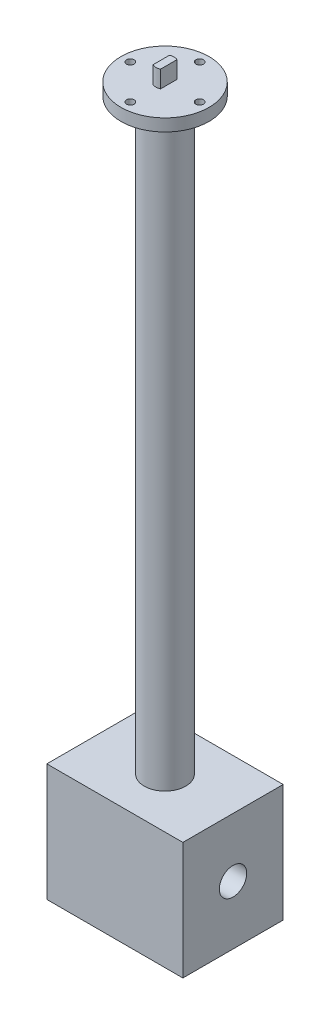
ISO-10303-21;
HEADER;
FILE_DESCRIPTION(('STEP AP214'),'2;1');
FILE_NAME('part.step','',(''),(''),'','','');
FILE_SCHEMA(('AUTOMOTIVE_DESIGN { 1 0 10303 214 1 1 1 1 }'));
ENDSEC;
DATA;
#1=APPLICATION_CONTEXT('core data for automotive mechanical design processes');
#2=APPLICATION_PROTOCOL_DEFINITION('international standard','automotive_design',2000,#1);
#3=PRODUCT_CONTEXT('',#1,'mechanical');
#4=PRODUCT('Part','Part','',(#3));
#5=PRODUCT_RELATED_PRODUCT_CATEGORY('part','',(#4));
#6=PRODUCT_DEFINITION_FORMATION('','',#4);
#7=PRODUCT_DEFINITION_CONTEXT('part definition',#1,'design');
#8=PRODUCT_DEFINITION('design','',#6,#7);
#9=PRODUCT_DEFINITION_SHAPE('','',#8);
#10=(LENGTH_UNIT() NAMED_UNIT(*) SI_UNIT(.MILLI.,.METRE.));
#11=(NAMED_UNIT(*) PLANE_ANGLE_UNIT() SI_UNIT($,.RADIAN.));
#12=(NAMED_UNIT(*) SI_UNIT($,.STERADIAN.) SOLID_ANGLE_UNIT());
#13=UNCERTAINTY_MEASURE_WITH_UNIT(LENGTH_MEASURE(1.E-05),#10,'distance_accuracy_value','');
#14=(GEOMETRIC_REPRESENTATION_CONTEXT(3) GLOBAL_UNCERTAINTY_ASSIGNED_CONTEXT((#13)) GLOBAL_UNIT_ASSIGNED_CONTEXT((#10,
#11,#12)) REPRESENTATION_CONTEXT('',''));
#15=CARTESIAN_POINT('',(0.,0.,0.));
#16=DIRECTION('',(0.,0.,1.));
#17=DIRECTION('',(1.,0.,0.));
#18=AXIS2_PLACEMENT_3D('',#15,#16,#17);
#19=CARTESIAN_POINT('',(0.,6.35,0.));
#20=DIRECTION('',(0.,1.,0.));
#21=DIRECTION('',(0.,0.,1.));
#22=AXIS2_PLACEMENT_3D('',#19,#20,#21);
#23=PLANE('',#22);
#24=CARTESIAN_POINT('',(18.,6.35,-1.88539992297529E-13));
#25=DIRECTION('',(0.,1.,0.));
#26=DIRECTION('',(0.,0.,1.));
#27=AXIS2_PLACEMENT_3D('',#24,#25,#26);
#28=CIRCLE('',#27,1.984375);
#29=CARTESIAN_POINT('',(18.,6.35,1.98437499999981));
#30=VERTEX_POINT('',#29);
#31=EDGE_CURVE('E123',#30,#30,#28,.T.);
#32=ORIENTED_EDGE('',*,*,#31,.F.);
#33=EDGE_LOOP('',(#32));
#34=FACE_BOUND('',#33,.T.);
#35=CARTESIAN_POINT('',(0.,6.35,18.));
#36=DIRECTION('',(0.,1.,0.));
#37=DIRECTION('',(0.,0.,1.));
#38=AXIS2_PLACEMENT_3D('',#35,#36,#37);
#39=CIRCLE('',#38,1.984375);
#40=CARTESIAN_POINT('',(0.,6.35,19.984375));
#41=VERTEX_POINT('',#40);
#42=EDGE_CURVE('E134',#41,#41,#39,.T.);
#43=ORIENTED_EDGE('',*,*,#42,.F.);
#44=EDGE_LOOP('',(#43));
#45=FACE_BOUND('',#44,.T.);
#46=CARTESIAN_POINT('',(-18.,6.35,0.));
#47=DIRECTION('',(0.,1.,0.));
#48=DIRECTION('',(0.,0.,1.));
#49=AXIS2_PLACEMENT_3D('',#46,#47,#48);
#50=CIRCLE('',#49,1.984375);
#51=CARTESIAN_POINT('',(-18.,6.35,1.98437500000006));
#52=VERTEX_POINT('',#51);
#53=EDGE_CURVE('E140',#52,#52,#50,.T.);
#54=ORIENTED_EDGE('',*,*,#53,.F.);
#55=EDGE_LOOP('',(#54));
#56=FACE_BOUND('',#55,.T.);
#57=CARTESIAN_POINT('',(0.,6.35,-18.));
#58=DIRECTION('',(0.,1.,0.));
#59=DIRECTION('',(0.,0.,1.));
#60=AXIS2_PLACEMENT_3D('',#57,#58,#59);
#61=CIRCLE('',#60,1.984375);
#62=CARTESIAN_POINT('',(0.,6.35,-16.015625));
#63=VERTEX_POINT('',#62);
#64=EDGE_CURVE('E146',#63,#63,#61,.T.);
#65=ORIENTED_EDGE('',*,*,#64,.F.);
#66=EDGE_LOOP('',(#65));
#67=FACE_BOUND('',#66,.T.);
#68=CARTESIAN_POINT('',(0.,6.35,0.));
#69=DIRECTION('',(0.,1.,0.));
#70=DIRECTION('',(0.,0.,1.));
#71=AXIS2_PLACEMENT_3D('',#68,#69,#70);
#72=CIRCLE('',#71,22.86);
#73=CARTESIAN_POINT('',(0.,6.35,22.86));
#74=VERTEX_POINT('',#73);
#75=EDGE_CURVE('E181',#74,#74,#72,.T.);
#76=ORIENTED_EDGE('',*,*,#75,.T.);
#77=EDGE_LOOP('',(#76));
#78=FACE_BOUND('',#77,.T.);
#79=CARTESIAN_POINT('',(0.,6.35,0.));
#80=DIRECTION('',(0.,1.,0.));
#81=DIRECTION('',(0.,0.,1.));
#82=AXIS2_PLACEMENT_3D('',#79,#80,#81);
#83=CIRCLE('',#82,4.699);
#84=CARTESIAN_POINT('',(1.9685,6.35,-4.26680310654242));
#85=VERTEX_POINT('',#84);
#86=CARTESIAN_POINT('',(-1.9685,6.35,-4.26680310654242));
#87=VERTEX_POINT('',#86);
#88=EDGE_CURVE('E164',#85,#87,#83,.T.);
#89=ORIENTED_EDGE('',*,*,#88,.F.);
#90=DIRECTION('',(0.,0.,1.));
#91=VECTOR('',#90,1.);
#92=CARTESIAN_POINT('',(1.9685,6.35,0.));
#93=LINE('',#92,#91);
#94=CARTESIAN_POINT('',(1.9685,6.35,4.26680310654242));
#95=VERTEX_POINT('',#94);
#96=EDGE_CURVE('E49',#85,#95,#93,.T.);
#97=ORIENTED_EDGE('',*,*,#96,.T.);
#98=CARTESIAN_POINT('',(-1.9685,6.35,4.26680310654241));
#99=VERTEX_POINT('',#98);
#100=EDGE_CURVE('E54',#99,#95,#83,.T.);
#101=ORIENTED_EDGE('',*,*,#100,.F.);
#102=DIRECTION('',(0.,0.,1.));
#103=VECTOR('',#102,1.);
#104=CARTESIAN_POINT('',(-1.9685,6.35,0.));
#105=LINE('',#104,#103);
#106=EDGE_CURVE('E167',#87,#99,#105,.T.);
#107=ORIENTED_EDGE('',*,*,#106,.F.);
#108=EDGE_LOOP('',(#89,#97,#101,#107));
#109=FACE_BOUND('',#108,.T.);
#110=ADVANCED_FACE('F34',(#34,#45,#56,#67,#78,#109),#23,.T.);
#111=CARTESIAN_POINT('',(0.,6.35,0.));
#112=DIRECTION('',(0.,-1.,0.));
#113=DIRECTION('',(0.,0.,-1.));
#114=AXIS2_PLACEMENT_3D('',#111,#112,#113);
#115=CYLINDRICAL_SURFACE('',#114,22.86);
#116=ORIENTED_EDGE('',*,*,#75,.F.);
#117=EDGE_LOOP('',(#116));
#118=FACE_BOUND('',#117,.T.);
#119=CARTESIAN_POINT('',(0.,0.,0.));
#120=DIRECTION('',(0.,1.,0.));
#121=DIRECTION('',(0.,0.,1.));
#122=AXIS2_PLACEMENT_3D('',#119,#120,#121);
#123=CIRCLE('',#122,22.86);
#124=CARTESIAN_POINT('',(0.,0.,22.86));
#125=VERTEX_POINT('',#124);
#126=EDGE_CURVE('E180',#125,#125,#123,.T.);
#127=ORIENTED_EDGE('',*,*,#126,.T.);
#128=EDGE_LOOP('',(#127));
#129=FACE_BOUND('',#128,.T.);
#130=ADVANCED_FACE('F205',(#118,#129),#115,.T.);
#131=CARTESIAN_POINT('',(0.,0.,0.));
#132=DIRECTION('',(0.,1.,0.));
#133=DIRECTION('',(0.,0.,1.));
#134=AXIS2_PLACEMENT_3D('',#131,#132,#133);
#135=PLANE('',#134);
#136=CARTESIAN_POINT('',(18.,0.,-1.88539992297529E-13));
#137=DIRECTION('',(0.,1.,0.));
#138=DIRECTION('',(0.,0.,1.));
#139=AXIS2_PLACEMENT_3D('',#136,#137,#138);
#140=CIRCLE('',#139,1.984375);
#141=CARTESIAN_POINT('',(18.,0.,1.98437499999981));
#142=VERTEX_POINT('',#141);
#143=EDGE_CURVE('E126',#142,#142,#140,.T.);
#144=ORIENTED_EDGE('',*,*,#143,.T.);
#145=EDGE_LOOP('',(#144));
#146=FACE_BOUND('',#145,.T.);
#147=CARTESIAN_POINT('',(0.,0.,18.));
#148=DIRECTION('',(0.,1.,0.));
#149=DIRECTION('',(0.,0.,1.));
#150=AXIS2_PLACEMENT_3D('',#147,#148,#149);
#151=CIRCLE('',#150,1.984375);
#152=CARTESIAN_POINT('',(0.,0.,19.984375));
#153=VERTEX_POINT('',#152);
#154=EDGE_CURVE('E137',#153,#153,#151,.T.);
#155=ORIENTED_EDGE('',*,*,#154,.T.);
#156=EDGE_LOOP('',(#155));
#157=FACE_BOUND('',#156,.T.);
#158=CARTESIAN_POINT('',(-18.,0.,0.));
#159=DIRECTION('',(0.,1.,0.));
#160=DIRECTION('',(0.,0.,1.));
#161=AXIS2_PLACEMENT_3D('',#158,#159,#160);
#162=CIRCLE('',#161,1.984375);
#163=CARTESIAN_POINT('',(-18.,0.,1.98437500000006));
#164=VERTEX_POINT('',#163);
#165=EDGE_CURVE('E143',#164,#164,#162,.T.);
#166=ORIENTED_EDGE('',*,*,#165,.T.);
#167=EDGE_LOOP('',(#166));
#168=FACE_BOUND('',#167,.T.);
#169=CARTESIAN_POINT('',(0.,0.,-18.));
#170=DIRECTION('',(0.,1.,0.));
#171=DIRECTION('',(0.,0.,1.));
#172=AXIS2_PLACEMENT_3D('',#169,#170,#171);
#173=CIRCLE('',#172,1.984375);
#174=CARTESIAN_POINT('',(0.,0.,-16.015625));
#175=VERTEX_POINT('',#174);
#176=EDGE_CURVE('E149',#175,#175,#173,.T.);
#177=ORIENTED_EDGE('',*,*,#176,.T.);
#178=EDGE_LOOP('',(#177));
#179=FACE_BOUND('',#178,.T.);
#180=CARTESIAN_POINT('',(0.,0.,0.));
#181=DIRECTION('',(0.,1.,0.));
#182=DIRECTION('',(0.,0.,1.));
#183=AXIS2_PLACEMENT_3D('',#180,#181,#182);
#184=CIRCLE('',#183,14.6050000000003);
#185=CARTESIAN_POINT('',(0.,0.,14.6050000000003));
#186=VERTEX_POINT('',#185);
#187=EDGE_CURVE('E11',#186,#186,#184,.T.);
#188=ORIENTED_EDGE('',*,*,#187,.T.);
#189=EDGE_LOOP('',(#188));
#190=FACE_BOUND('',#189,.T.);
#191=ORIENTED_EDGE('',*,*,#126,.F.);
#192=EDGE_LOOP('',(#191));
#193=FACE_BOUND('',#192,.T.);
#194=ADVANCED_FACE('F211',(#146,#157,#168,#179,#190,#193),#135,.F.);
#195=CARTESIAN_POINT('',(1.9685,15.24,0.));
#196=DIRECTION('',(1.,0.,0.));
#197=DIRECTION('',(0.,0.,-1.));
#198=AXIS2_PLACEMENT_3D('',#195,#196,#197);
#199=PLANE('',#198);
#200=ORIENTED_EDGE('',*,*,#96,.F.);
#201=DIRECTION('',(0.,-1.,0.));
#202=VECTOR('',#201,1.);
#203=CARTESIAN_POINT('',(1.9685,15.24,-4.26680310654242));
#204=LINE('',#203,#202);
#205=CARTESIAN_POINT('',(1.9685,15.24,-4.26680310654242));
#206=VERTEX_POINT('',#205);
#207=EDGE_CURVE('E177',#206,#85,#204,.T.);
#208=ORIENTED_EDGE('',*,*,#207,.F.);
#209=DIRECTION('',(0.,0.,1.));
#210=VECTOR('',#209,1.);
#211=CARTESIAN_POINT('',(1.9685,15.24,0.));
#212=LINE('',#211,#210);
#213=CARTESIAN_POINT('',(1.9685,15.24,4.26680310654242));
#214=VERTEX_POINT('',#213);
#215=EDGE_CURVE('E155',#206,#214,#212,.T.);
#216=ORIENTED_EDGE('',*,*,#215,.T.);
#217=DIRECTION('',(0.,-1.,0.));
#218=VECTOR('',#217,1.);
#219=CARTESIAN_POINT('',(1.9685,15.24,4.26680310654242));
#220=LINE('',#219,#218);
#221=EDGE_CURVE('E169',#214,#95,#220,.T.);
#222=ORIENTED_EDGE('',*,*,#221,.T.);
#223=EDGE_LOOP('',(#200,#208,#216,#222));
#224=FACE_BOUND('',#223,.T.);
#225=ADVANCED_FACE('F217',(#224),#199,.T.);
#226=CARTESIAN_POINT('',(0.,15.24,0.));
#227=DIRECTION('',(0.,-1.,0.));
#228=DIRECTION('',(0.,0.,-1.));
#229=AXIS2_PLACEMENT_3D('',#226,#227,#228);
#230=CYLINDRICAL_SURFACE('',#229,4.699);
#231=ORIENTED_EDGE('',*,*,#88,.T.);
#232=DIRECTION('',(0.,-1.,0.));
#233=VECTOR('',#232,1.);
#234=CARTESIAN_POINT('',(-1.9685,15.24,-4.26680310654242));
#235=LINE('',#234,#233);
#236=CARTESIAN_POINT('',(-1.9685,15.24,-4.26680310654242));
#237=VERTEX_POINT('',#236);
#238=EDGE_CURVE('E174',#237,#87,#235,.T.);
#239=ORIENTED_EDGE('',*,*,#238,.F.);
#240=CARTESIAN_POINT('',(0.,15.24,0.));
#241=DIRECTION('',(0.,1.,0.));
#242=DIRECTION('',(0.,0.,1.));
#243=AXIS2_PLACEMENT_3D('',#240,#241,#242);
#244=CIRCLE('',#243,4.699);
#245=EDGE_CURVE('E158',#206,#237,#244,.T.);
#246=ORIENTED_EDGE('',*,*,#245,.F.);
#247=ORIENTED_EDGE('',*,*,#207,.T.);
#248=EDGE_LOOP('',(#231,#239,#246,#247));
#249=FACE_BOUND('',#248,.T.);
#250=ADVANCED_FACE('F224',(#249),#230,.T.);
#251=CARTESIAN_POINT('',(-1.9685,15.24,0.));
#252=DIRECTION('',(1.,0.,0.));
#253=DIRECTION('',(0.,0.,-1.));
#254=AXIS2_PLACEMENT_3D('',#251,#252,#253);
#255=PLANE('',#254);
#256=ORIENTED_EDGE('',*,*,#106,.T.);
#257=DIRECTION('',(0.,-1.,0.));
#258=VECTOR('',#257,1.);
#259=CARTESIAN_POINT('',(-1.9685,15.24,4.26680310654241));
#260=LINE('',#259,#258);
#261=CARTESIAN_POINT('',(-1.9685,15.24,4.26680310654241));
#262=VERTEX_POINT('',#261);
#263=EDGE_CURVE('E171',#262,#99,#260,.T.);
#264=ORIENTED_EDGE('',*,*,#263,.F.);
#265=DIRECTION('',(0.,0.,1.));
#266=VECTOR('',#265,1.);
#267=CARTESIAN_POINT('',(-1.9685,15.24,0.));
#268=LINE('',#267,#266);
#269=EDGE_CURVE('E160',#237,#262,#268,.T.);
#270=ORIENTED_EDGE('',*,*,#269,.F.);
#271=ORIENTED_EDGE('',*,*,#238,.T.);
#272=EDGE_LOOP('',(#256,#264,#270,#271));
#273=FACE_BOUND('',#272,.T.);
#274=ADVANCED_FACE('F253',(#273),#255,.F.);
#275=ORIENTED_EDGE('',*,*,#100,.T.);
#276=ORIENTED_EDGE('',*,*,#221,.F.);
#277=EDGE_CURVE('E161',#262,#214,#244,.T.);
#278=ORIENTED_EDGE('',*,*,#277,.F.);
#279=ORIENTED_EDGE('',*,*,#263,.T.);
#280=EDGE_LOOP('',(#275,#276,#278,#279));
#281=FACE_BOUND('',#280,.T.);
#282=ADVANCED_FACE('F249',(#281),#230,.T.);
#283=CARTESIAN_POINT('',(0.,15.24,0.));
#284=DIRECTION('',(0.,1.,0.));
#285=DIRECTION('',(0.,0.,1.));
#286=AXIS2_PLACEMENT_3D('',#283,#284,#285);
#287=PLANE('',#286);
#288=ORIENTED_EDGE('',*,*,#215,.F.);
#289=ORIENTED_EDGE('',*,*,#245,.T.);
#290=ORIENTED_EDGE('',*,*,#269,.T.);
#291=ORIENTED_EDGE('',*,*,#277,.T.);
#292=EDGE_LOOP('',(#288,#289,#290,#291));
#293=FACE_BOUND('',#292,.T.);
#294=ADVANCED_FACE('F201',(#293),#287,.T.);
#295=CARTESIAN_POINT('',(0.,-304.8,0.));
#296=DIRECTION('',(0.,1.,0.));
#297=DIRECTION('',(0.,0.,1.));
#298=AXIS2_PLACEMENT_3D('',#295,#296,#297);
#299=CYLINDRICAL_SURFACE('',#298,10.795);
#300=CARTESIAN_POINT('',(0.,-3.81000000000037,0.));
#301=DIRECTION('',(0.,1.,0.));
#302=DIRECTION('',(0.,0.,1.));
#303=AXIS2_PLACEMENT_3D('',#300,#301,#302);
#304=CIRCLE('',#303,10.795);
#305=CARTESIAN_POINT('',(0.,-3.81000000000042,10.795));
#306=VERTEX_POINT('',#305);
#307=EDGE_CURVE('E42',#306,#306,#304,.F.);
#308=CARTESIAN_POINT('',(0.,-304.8,0.));
#309=DIRECTION('',(0.,-1.,0.));
#310=DIRECTION('',(0.,0.,-1.));
#311=AXIS2_PLACEMENT_3D('',#308,#309,#310);
#312=CIRCLE('',#311,10.795);
#313=CARTESIAN_POINT('',(0.,-304.8,10.795));
#314=VERTEX_POINT('',#313);
#315=EDGE_CURVE('E152',#314,#314,#312,.T.);
#316=CARTESIAN_POINT('',(0.,-3.81000000000042,10.795));
#317=CARTESIAN_POINT('',(0.,-6.94531250000041,10.795));
#318=CARTESIAN_POINT('',(0.,-10.0806250000004,10.795));
#319=CARTESIAN_POINT('',(0.,-16.3512500000004,10.795));
#320=CARTESIAN_POINT('',(0.,-19.4865625000004,10.795));
#321=CARTESIAN_POINT('',(0.,-25.7571875000004,10.795));
#322=CARTESIAN_POINT('',(0.,-28.8925000000004,10.795));
#323=CARTESIAN_POINT('',(0.,-35.1631250000004,10.795));
#324=CARTESIAN_POINT('',(0.,-38.2984375000004,10.795));
#325=CARTESIAN_POINT('',(0.,-44.5690625000004,10.795));
#326=CARTESIAN_POINT('',(0.,-47.7043750000004,10.795));
#327=CARTESIAN_POINT('',(0.,-53.9750000000003,10.795));
#328=CARTESIAN_POINT('',(0.,-57.1103125000003,10.795));
#329=CARTESIAN_POINT('',(0.,-63.3809375000003,10.795));
#330=CARTESIAN_POINT('',(0.,-66.5162500000003,10.795));
#331=CARTESIAN_POINT('',(0.,-72.7868750000003,10.795));
#332=CARTESIAN_POINT('',(0.,-75.9221875000003,10.795));
#333=CARTESIAN_POINT('',(0.,-82.1928125000003,10.795));
#334=CARTESIAN_POINT('',(0.,-85.3281250000003,10.795));
#335=CARTESIAN_POINT('',(0.,-91.5987500000003,10.795));
#336=CARTESIAN_POINT('',(0.,-94.7340625000003,10.795));
#337=CARTESIAN_POINT('',(0.,-101.0046875,10.795));
#338=CARTESIAN_POINT('',(0.,-104.14,10.795));
#339=CARTESIAN_POINT('',(0.,-110.410625,10.795));
#340=CARTESIAN_POINT('',(0.,-113.5459375,10.795));
#341=CARTESIAN_POINT('',(0.,-119.8165625,10.795));
#342=CARTESIAN_POINT('',(0.,-122.951875,10.795));
#343=CARTESIAN_POINT('',(0.,-129.2225,10.795));
#344=CARTESIAN_POINT('',(0.,-132.3578125,10.795));
#345=CARTESIAN_POINT('',(0.,-138.6284375,10.795));
#346=CARTESIAN_POINT('',(0.,-141.76375,10.795));
#347=CARTESIAN_POINT('',(0.,-148.034375,10.795));
#348=CARTESIAN_POINT('',(0.,-151.1696875,10.795));
#349=CARTESIAN_POINT('',(0.,-157.4403125,10.795));
#350=CARTESIAN_POINT('',(0.,-160.575625,10.795));
#351=CARTESIAN_POINT('',(0.,-166.84625,10.795));
#352=CARTESIAN_POINT('',(0.,-169.9815625,10.795));
#353=CARTESIAN_POINT('',(0.,-176.2521875,10.795));
#354=CARTESIAN_POINT('',(0.,-179.3875,10.795));
#355=CARTESIAN_POINT('',(0.,-185.658125,10.795));
#356=CARTESIAN_POINT('',(0.,-188.7934375,10.795));
#357=CARTESIAN_POINT('',(0.,-195.0640625,10.795));
#358=CARTESIAN_POINT('',(0.,-198.199375,10.795));
#359=CARTESIAN_POINT('',(0.,-204.47,10.795));
#360=CARTESIAN_POINT('',(0.,-207.6053125,10.795));
#361=CARTESIAN_POINT('',(0.,-213.8759375,10.795));
#362=CARTESIAN_POINT('',(0.,-217.01125,10.795));
#363=CARTESIAN_POINT('',(0.,-223.281875,10.795));
#364=CARTESIAN_POINT('',(0.,-226.4171875,10.795));
#365=CARTESIAN_POINT('',(0.,-232.6878125,10.795));
#366=CARTESIAN_POINT('',(0.,-235.823125,10.795));
#367=CARTESIAN_POINT('',(0.,-242.09375,10.795));
#368=CARTESIAN_POINT('',(0.,-245.2290625,10.795));
#369=CARTESIAN_POINT('',(0.,-251.4996875,10.795));
#370=CARTESIAN_POINT('',(0.,-254.635,10.795));
#371=CARTESIAN_POINT('',(0.,-260.905625,10.795));
#372=CARTESIAN_POINT('',(0.,-264.0409375,10.795));
#373=CARTESIAN_POINT('',(0.,-270.3115625,10.795));
#374=CARTESIAN_POINT('',(0.,-273.446875,10.795));
#375=CARTESIAN_POINT('',(0.,-279.7175,10.795));
#376=CARTESIAN_POINT('',(0.,-282.8528125,10.795));
#377=CARTESIAN_POINT('',(0.,-289.1234375,10.795));
#378=CARTESIAN_POINT('',(0.,-292.25875,10.795));
#379=CARTESIAN_POINT('',(0.,-298.529375,10.795));
#380=CARTESIAN_POINT('',(0.,-301.6646875,10.795));
#381=CARTESIAN_POINT('',(0.,-304.8,10.795));
#382=B_SPLINE_CURVE_WITH_KNOTS('',3,(#316,#317,#318,#319,#320,#321,#322,#323,#324,#325,#326,
#327,#328,#329,#330,#331,#332,#333,#334,#335,#336,#337,#338,#339,#340,#341,#342,#343,#344,#345,
#346,#347,#348,#349,#350,#351,#352,#353,#354,#355,#356,#357,#358,#359,#360,#361,#362,#363,#364,
#365,#366,#367,#368,#369,#370,#371,#372,#373,#374,#375,#376,#377,#378,#379,#380,#381),
.UNSPECIFIED.,.F.,.F.,(4,2,2,2,2,2,2,2,2,2,2,2,2,2,2,2,2,2,2,2,2,2,2,2,2,2,2,2,2,2,2,2,4),(0.,
9.40593749999996,18.811875,28.2178125,37.62375,47.0296874999999,56.4356249999999,
65.8415624999999,75.2474999999999,84.6534374999999,94.0593749999999,103.4653125,112.87125,
122.2771875,131.683125,141.0890625,150.495,159.9009375,169.306875,178.7128125,188.11875,
197.5246875,206.930625,216.3365625,225.7425,235.1484375,244.554375,253.9603125,263.36625,
272.7721875,282.178125,291.5840625,300.99),.UNSPECIFIED.);
#383=EDGE_CURVE('BSEAM188',#306,#314,#382,.T.);
#384=ORIENTED_EDGE('',*,*,#307,.T.);
#385=ORIENTED_EDGE('',*,*,#315,.F.);
#386=ORIENTED_EDGE('',*,*,#383,.T.);
#387=ORIENTED_EDGE('',*,*,#383,.F.);
#388=EDGE_LOOP('',(#384,#386,#385,#387));
#389=FACE_BOUND('',#388,.T.);
#390=ADVANCED_FACE('F188',(#389),#299,.T.);
#391=CARTESIAN_POINT('',(0.,-3.81000000000031,0.));
#392=DIRECTION('',(0.,1.,0.));
#393=DIRECTION('',(0.,0.,1.));
#394=AXIS2_PLACEMENT_3D('',#391,#392,#393);
#395=CONICAL_SURFACE('',#394,10.795,0.785398163397448);
#396=CARTESIAN_POINT('',(0.,0.,14.6050000000003));
#397=CARTESIAN_POINT('',(0.,-0.0396875000000042,14.5653125000003));
#398=CARTESIAN_POINT('',(0.,-0.0793750000000081,14.5256250000003));
#399=CARTESIAN_POINT('',(0.,-0.158750000000016,14.4462500000003));
#400=CARTESIAN_POINT('',(0.,-0.19843750000002,14.4065625000003));
#401=CARTESIAN_POINT('',(0.,-0.277812500000027,14.3271875000003));
#402=CARTESIAN_POINT('',(0.,-0.317500000000031,14.2875000000003));
#403=CARTESIAN_POINT('',(0.,-0.396875000000039,14.2081250000003));
#404=CARTESIAN_POINT('',(0.,-0.436562500000043,14.1684375000003));
#405=CARTESIAN_POINT('',(0.,-0.51593750000005,14.0890625000003));
#406=CARTESIAN_POINT('',(0.,-0.555625000000054,14.0493750000003));
#407=CARTESIAN_POINT('',(0.,-0.635000000000062,13.9700000000002));
#408=CARTESIAN_POINT('',(0.,-0.674687500000066,13.9303125000002));
#409=CARTESIAN_POINT('',(0.,-0.754062500000073,13.8509375000002));
#410=CARTESIAN_POINT('',(0.,-0.793750000000077,13.8112500000002));
#411=CARTESIAN_POINT('',(0.,-0.873125000000085,13.7318750000002));
#412=CARTESIAN_POINT('',(0.,-0.912812500000089,13.6921875000002));
#413=CARTESIAN_POINT('',(0.,-0.992187500000096,13.6128125000002));
#414=CARTESIAN_POINT('',(0.,-1.0318750000001,13.5731250000002));
#415=CARTESIAN_POINT('',(0.,-1.11125000000011,13.4937500000002));
#416=CARTESIAN_POINT('',(0.,-1.15093750000011,13.4540625000002));
#417=CARTESIAN_POINT('',(0.,-1.23031250000012,13.3746875000002));
#418=CARTESIAN_POINT('',(0.,-1.27000000000012,13.3350000000002));
#419=CARTESIAN_POINT('',(0.,-1.34937500000013,13.2556250000002));
#420=CARTESIAN_POINT('',(0.,-1.38906250000014,13.2159375000002));
#421=CARTESIAN_POINT('',(0.,-1.46843750000014,13.1365625000002));
#422=CARTESIAN_POINT('',(0.,-1.50812500000015,13.0968750000002));
#423=CARTESIAN_POINT('',(0.,-1.58750000000015,13.0175000000002));
#424=CARTESIAN_POINT('',(0.,-1.62718750000016,12.9778125000002));
#425=CARTESIAN_POINT('',(0.,-1.70656250000017,12.8984375000001));
#426=CARTESIAN_POINT('',(0.,-1.74625000000017,12.8587500000001));
#427=CARTESIAN_POINT('',(0.,-1.82562500000018,12.7793750000001));
#428=CARTESIAN_POINT('',(0.,-1.86531250000018,12.7396875000001));
#429=CARTESIAN_POINT('',(0.,-1.94468750000019,12.6603125000001));
#430=CARTESIAN_POINT('',(0.,-1.98437500000019,12.6206250000001));
#431=CARTESIAN_POINT('',(0.,-2.0637500000002,12.5412500000001));
#432=CARTESIAN_POINT('',(0.,-2.1034375000002,12.5015625000001));
#433=CARTESIAN_POINT('',(0.,-2.18281250000021,12.4221875000001));
#434=CARTESIAN_POINT('',(0.,-2.22250000000022,12.3825000000001));
#435=CARTESIAN_POINT('',(0.,-2.30187500000022,12.3031250000001));
#436=CARTESIAN_POINT('',(0.,-2.34156250000023,12.2634375000001));
#437=CARTESIAN_POINT('',(0.,-2.42093750000023,12.1840625000001));
#438=CARTESIAN_POINT('',(0.,-2.46062500000024,12.1443750000001));
#439=CARTESIAN_POINT('',(0.,-2.54000000000025,12.0650000000001));
#440=CARTESIAN_POINT('',(0.,-2.57968750000025,12.0253125000001));
#441=CARTESIAN_POINT('',(0.,-2.65906250000026,11.9459375000001));
#442=CARTESIAN_POINT('',(0.,-2.69875000000026,11.90625));
#443=CARTESIAN_POINT('',(0.,-2.77812500000027,11.826875));
#444=CARTESIAN_POINT('',(0.,-2.81781250000027,11.7871875));
#445=CARTESIAN_POINT('',(0.,-2.89718750000028,11.7078125));
#446=CARTESIAN_POINT('',(0.,-2.93687500000028,11.668125));
#447=CARTESIAN_POINT('',(0.,-3.01625000000029,11.58875));
#448=CARTESIAN_POINT('',(0.,-3.0559375000003,11.5490625));
#449=CARTESIAN_POINT('',(0.,-3.1353125000003,11.4696875));
#450=CARTESIAN_POINT('',(0.,-3.17500000000031,11.43));
#451=CARTESIAN_POINT('',(0.,-3.25437500000032,11.350625));
#452=CARTESIAN_POINT('',(0.,-3.29406250000032,11.3109375));
#453=CARTESIAN_POINT('',(0.,-3.37343750000033,11.2315625));
#454=CARTESIAN_POINT('',(0.,-3.41312500000033,11.191875));
#455=CARTESIAN_POINT('',(0.,-3.49250000000034,11.1125));
#456=CARTESIAN_POINT('',(0.,-3.53218750000034,11.0728125));
#457=CARTESIAN_POINT('',(0.,-3.61156250000035,10.9934375));
#458=CARTESIAN_POINT('',(0.,-3.65125000000035,10.95375));
#459=CARTESIAN_POINT('',(0.,-3.73062500000036,10.874375));
#460=CARTESIAN_POINT('',(0.,-3.77031250000037,10.8346874999999));
#461=CARTESIAN_POINT('',(0.,-3.81000000000037,10.7949999999999));
#462=B_SPLINE_CURVE_WITH_KNOTS('',3,(#396,#397,#398,#399,#400,#401,#402,#403,#404,#405,#406,
#407,#408,#409,#410,#411,#412,#413,#414,#415,#416,#417,#418,#419,#420,#421,#422,#423,#424,#425,
#426,#427,#428,#429,#430,#431,#432,#433,#434,#435,#436,#437,#438,#439,#440,#441,#442,#443,#444,
#445,#446,#447,#448,#449,#450,#451,#452,#453,#454,#455,#456,#457,#458,#459,#460,#461),
.UNSPECIFIED.,.F.,.F.,(4,2,2,2,2,2,2,2,2,2,2,2,2,2,2,2,2,2,2,2,2,2,2,2,2,2,2,2,2,2,2,2,4),(0.,
0.168379802270063,0.336759604540126,0.505139406810189,0.673519209080252,0.841899011350314,
1.01027881362038,1.17865861589044,1.3470384181605,1.51541822043057,1.68379802270063,
1.85217782497069,2.02055762724075,2.18893742951082,2.35731723178088,2.52569703405094,
2.69407683632101,2.86245663859107,3.03083644086113,3.1992162431312,3.36759604540126,
3.53597584767132,3.70435564994138,3.87273545221145,4.04111525448151,4.20949505675157,
4.37787485902164,4.5462546612917,4.71463446356176,4.88301426583182,5.05139406810189,
5.21977387037195,5.38815367264201),.UNSPECIFIED.);
#463=EDGE_CURVE('BSEAM36',#186,#306,#462,.T.);
#464=ORIENTED_EDGE('',*,*,#187,.F.);
#465=ORIENTED_EDGE('',*,*,#307,.F.);
#466=ORIENTED_EDGE('',*,*,#463,.T.);
#467=ORIENTED_EDGE('',*,*,#463,.F.);
#468=EDGE_LOOP('',(#464,#466,#465,#467));
#469=FACE_BOUND('',#468,.T.);
#470=ADVANCED_FACE('F36',(#469),#395,.T.);
#471=CARTESIAN_POINT('',(0.,6.35,-18.));
#472=DIRECTION('',(0.,1.,0.));
#473=DIRECTION('',(0.,0.,1.));
#474=AXIS2_PLACEMENT_3D('',#471,#472,#473);
#475=CYLINDRICAL_SURFACE('',#474,1.984375);
#476=ORIENTED_EDGE('',*,*,#176,.F.);
#477=EDGE_LOOP('',(#476));
#478=FACE_BOUND('',#477,.T.);
#479=ORIENTED_EDGE('',*,*,#64,.T.);
#480=EDGE_LOOP('',(#479));
#481=FACE_BOUND('',#480,.T.);
#482=ADVANCED_FACE('F192',(#478,#481),#475,.F.);
#483=CARTESIAN_POINT('',(-18.,6.35,0.));
#484=DIRECTION('',(0.,1.,0.));
#485=DIRECTION('',(0.,0.,1.));
#486=AXIS2_PLACEMENT_3D('',#483,#484,#485);
#487=CYLINDRICAL_SURFACE('',#486,1.984375);
#488=ORIENTED_EDGE('',*,*,#165,.F.);
#489=EDGE_LOOP('',(#488));
#490=FACE_BOUND('',#489,.T.);
#491=ORIENTED_EDGE('',*,*,#53,.T.);
#492=EDGE_LOOP('',(#491));
#493=FACE_BOUND('',#492,.T.);
#494=ADVANCED_FACE('F198',(#490,#493),#487,.F.);
#495=CARTESIAN_POINT('',(0.,6.35,18.));
#496=DIRECTION('',(0.,1.,0.));
#497=DIRECTION('',(0.,0.,1.));
#498=AXIS2_PLACEMENT_3D('',#495,#496,#497);
#499=CYLINDRICAL_SURFACE('',#498,1.984375);
#500=ORIENTED_EDGE('',*,*,#154,.F.);
#501=EDGE_LOOP('',(#500));
#502=FACE_BOUND('',#501,.T.);
#503=ORIENTED_EDGE('',*,*,#42,.T.);
#504=EDGE_LOOP('',(#503));
#505=FACE_BOUND('',#504,.T.);
#506=ADVANCED_FACE('F326',(#502,#505),#499,.F.);
#507=CARTESIAN_POINT('',(18.,6.35,-1.88539992297529E-13));
#508=DIRECTION('',(0.,1.,0.));
#509=DIRECTION('',(0.,0.,1.));
#510=AXIS2_PLACEMENT_3D('',#507,#508,#509);
#511=CYLINDRICAL_SURFACE('',#510,1.984375);
#512=ORIENTED_EDGE('',*,*,#143,.F.);
#513=EDGE_LOOP('',(#512));
#514=FACE_BOUND('',#513,.T.);
#515=ORIENTED_EDGE('',*,*,#31,.T.);
#516=EDGE_LOOP('',(#515));
#517=FACE_BOUND('',#516,.T.);
#518=ADVANCED_FACE('F333',(#514,#517),#511,.F.);
#519=CARTESIAN_POINT('',(-35.306,-365.76,26.035));
#520=DIRECTION('',(1.,0.,0.));
#521=DIRECTION('',(0.,0.,-1.));
#522=AXIS2_PLACEMENT_3D('',#519,#520,#521);
#523=PLANE('',#522);
#524=CARTESIAN_POINT('',(-35.306,-335.28,0.));
#525=DIRECTION('',(1.,0.,0.));
#526=DIRECTION('',(0.,0.,-1.));
#527=AXIS2_PLACEMENT_3D('',#524,#525,#526);
#528=CIRCLE('',#527,7.11199999999999);
#529=CARTESIAN_POINT('',(-35.306,-335.28,-7.112));
#530=VERTEX_POINT('',#529);
#531=EDGE_CURVE('E418',#530,#530,#528,.T.);
#532=ORIENTED_EDGE('',*,*,#531,.T.);
#533=EDGE_LOOP('',(#532));
#534=FACE_BOUND('',#533,.T.);
#535=DIRECTION('',(0.,0.,-1.));
#536=VECTOR('',#535,1.);
#537=CARTESIAN_POINT('',(-35.306,-304.8,26.035));
#538=LINE('',#537,#536);
#539=CARTESIAN_POINT('',(-35.306,-304.8,26.035));
#540=VERTEX_POINT('',#539);
#541=CARTESIAN_POINT('',(-35.306,-304.8,-26.035));
#542=VERTEX_POINT('',#541);
#543=EDGE_CURVE('E122',#540,#542,#538,.T.);
#544=ORIENTED_EDGE('',*,*,#543,.T.);
#545=DIRECTION('',(0.,1.,0.));
#546=VECTOR('',#545,1.);
#547=CARTESIAN_POINT('',(-35.306,-365.76,-26.035));
#548=LINE('',#547,#546);
#549=CARTESIAN_POINT('',(-35.306,-365.76,-26.035));
#550=VERTEX_POINT('',#549);
#551=EDGE_CURVE('E102',#550,#542,#548,.T.);
#552=ORIENTED_EDGE('',*,*,#551,.F.);
#553=DIRECTION('',(0.,0.,-1.));
#554=VECTOR('',#553,1.);
#555=CARTESIAN_POINT('',(-35.306,-365.76,26.035));
#556=LINE('',#555,#554);
#557=CARTESIAN_POINT('',(-35.306,-365.76,26.035));
#558=VERTEX_POINT('',#557);
#559=EDGE_CURVE('E109',#558,#550,#556,.T.);
#560=ORIENTED_EDGE('',*,*,#559,.F.);
#561=DIRECTION('',(0.,1.,0.));
#562=VECTOR('',#561,1.);
#563=CARTESIAN_POINT('',(-35.306,-365.76,26.035));
#564=LINE('',#563,#562);
#565=EDGE_CURVE('E427',#558,#540,#564,.T.);
#566=ORIENTED_EDGE('',*,*,#565,.T.);
#567=EDGE_LOOP('',(#544,#552,#560,#566));
#568=FACE_BOUND('',#567,.T.);
#569=ADVANCED_FACE('F120',(#534,#568),#523,.F.);
#570=CARTESIAN_POINT('',(-35.306,-365.76,-26.035));
#571=DIRECTION('',(0.,0.,1.));
#572=DIRECTION('',(1.,0.,0.));
#573=AXIS2_PLACEMENT_3D('',#570,#571,#572);
#574=PLANE('',#573);
#575=DIRECTION('',(1.,0.,0.));
#576=VECTOR('',#575,1.);
#577=CARTESIAN_POINT('',(-35.306,-304.8,-26.035));
#578=LINE('',#577,#576);
#579=CARTESIAN_POINT('',(35.306,-304.8,-26.035));
#580=VERTEX_POINT('',#579);
#581=EDGE_CURVE('E429',#542,#580,#578,.T.);
#582=ORIENTED_EDGE('',*,*,#581,.T.);
#583=DIRECTION('',(0.,1.,0.));
#584=VECTOR('',#583,1.);
#585=CARTESIAN_POINT('',(35.306,-365.76,-26.035));
#586=LINE('',#585,#584);
#587=CARTESIAN_POINT('',(35.306,-365.76,-26.035));
#588=VERTEX_POINT('',#587);
#589=EDGE_CURVE('E105',#588,#580,#586,.T.);
#590=ORIENTED_EDGE('',*,*,#589,.F.);
#591=DIRECTION('',(1.,0.,0.));
#592=VECTOR('',#591,1.);
#593=CARTESIAN_POINT('',(-35.306,-365.76,-26.035));
#594=LINE('',#593,#592);
#595=EDGE_CURVE('E98',#550,#588,#594,.T.);
#596=ORIENTED_EDGE('',*,*,#595,.F.);
#597=ORIENTED_EDGE('',*,*,#551,.T.);
#598=EDGE_LOOP('',(#582,#590,#596,#597));
#599=FACE_BOUND('',#598,.T.);
#600=ADVANCED_FACE('F100',(#599),#574,.F.);
#601=CARTESIAN_POINT('',(35.306,-365.76,26.035));
#602=DIRECTION('',(-1.,0.,0.));
#603=DIRECTION('',(0.,0.,1.));
#604=AXIS2_PLACEMENT_3D('',#601,#602,#603);
#605=PLANE('',#604);
#606=CARTESIAN_POINT('',(35.306,-335.28,0.));
#607=DIRECTION('',(1.,0.,0.));
#608=DIRECTION('',(0.,0.,-1.));
#609=AXIS2_PLACEMENT_3D('',#606,#607,#608);
#610=CIRCLE('',#609,7.11199999999999);
#611=CARTESIAN_POINT('',(35.306,-335.28,-7.112));
#612=VERTEX_POINT('',#611);
#613=EDGE_CURVE('E421',#612,#612,#610,.T.);
#614=ORIENTED_EDGE('',*,*,#613,.F.);
#615=EDGE_LOOP('',(#614));
#616=FACE_BOUND('',#615,.T.);
#617=DIRECTION('',(0.,0.,1.));
#618=VECTOR('',#617,1.);
#619=CARTESIAN_POINT('',(35.306,-304.8,26.035));
#620=LINE('',#619,#618);
#621=CARTESIAN_POINT('',(35.306,-304.8,26.035));
#622=VERTEX_POINT('',#621);
#623=EDGE_CURVE('E431',#580,#622,#620,.T.);
#624=ORIENTED_EDGE('',*,*,#623,.T.);
#625=DIRECTION('',(0.,1.,0.));
#626=VECTOR('',#625,1.);
#627=CARTESIAN_POINT('',(35.306,-365.76,26.035));
#628=LINE('',#627,#626);
#629=CARTESIAN_POINT('',(35.306,-365.76,26.035));
#630=VERTEX_POINT('',#629);
#631=EDGE_CURVE('E128',#630,#622,#628,.T.);
#632=ORIENTED_EDGE('',*,*,#631,.F.);
#633=DIRECTION('',(0.,0.,1.));
#634=VECTOR('',#633,1.);
#635=CARTESIAN_POINT('',(35.306,-365.76,26.035));
#636=LINE('',#635,#634);
#637=EDGE_CURVE('E108',#588,#630,#636,.T.);
#638=ORIENTED_EDGE('',*,*,#637,.F.);
#639=ORIENTED_EDGE('',*,*,#589,.T.);
#640=EDGE_LOOP('',(#624,#632,#638,#639));
#641=FACE_BOUND('',#640,.T.);
#642=ADVANCED_FACE('F357',(#616,#641),#605,.F.);
#643=CARTESIAN_POINT('',(-35.306,-365.76,26.035));
#644=DIRECTION('',(0.,0.,-1.));
#645=DIRECTION('',(-1.,0.,0.));
#646=AXIS2_PLACEMENT_3D('',#643,#644,#645);
#647=PLANE('',#646);
#648=DIRECTION('',(-1.,0.,0.));
#649=VECTOR('',#648,1.);
#650=CARTESIAN_POINT('',(-35.306,-304.8,26.035));
#651=LINE('',#650,#649);
#652=EDGE_CURVE('E118',#622,#540,#651,.T.);
#653=ORIENTED_EDGE('',*,*,#652,.T.);
#654=ORIENTED_EDGE('',*,*,#565,.F.);
#655=DIRECTION('',(-1.,0.,0.));
#656=VECTOR('',#655,1.);
#657=CARTESIAN_POINT('',(-35.306,-365.76,26.035));
#658=LINE('',#657,#656);
#659=EDGE_CURVE('E114',#630,#558,#658,.T.);
#660=ORIENTED_EDGE('',*,*,#659,.F.);
#661=ORIENTED_EDGE('',*,*,#631,.T.);
#662=EDGE_LOOP('',(#653,#654,#660,#661));
#663=FACE_BOUND('',#662,.T.);
#664=ADVANCED_FACE('F364',(#663),#647,.F.);
#665=CARTESIAN_POINT('',(0.,-365.76,0.));
#666=DIRECTION('',(0.,-1.,0.));
#667=DIRECTION('',(0.,0.,-1.));
#668=AXIS2_PLACEMENT_3D('',#665,#666,#667);
#669=PLANE('',#668);
#670=ORIENTED_EDGE('',*,*,#559,.T.);
#671=ORIENTED_EDGE('',*,*,#595,.T.);
#672=ORIENTED_EDGE('',*,*,#637,.T.);
#673=ORIENTED_EDGE('',*,*,#659,.T.);
#674=EDGE_LOOP('',(#670,#671,#672,#673));
#675=FACE_BOUND('',#674,.T.);
#676=ADVANCED_FACE('F112',(#675),#669,.T.);
#677=CARTESIAN_POINT('',(0.,-304.8,0.));
#678=DIRECTION('',(0.,-1.,0.));
#679=DIRECTION('',(0.,0.,-1.));
#680=AXIS2_PLACEMENT_3D('',#677,#678,#679);
#681=PLANE('',#680);
#682=ORIENTED_EDGE('',*,*,#315,.T.);
#683=EDGE_LOOP('',(#682));
#684=FACE_BOUND('',#683,.T.);
#685=ORIENTED_EDGE('',*,*,#543,.F.);
#686=ORIENTED_EDGE('',*,*,#652,.F.);
#687=ORIENTED_EDGE('',*,*,#623,.F.);
#688=ORIENTED_EDGE('',*,*,#581,.F.);
#689=EDGE_LOOP('',(#685,#686,#687,#688));
#690=FACE_BOUND('',#689,.T.);
#691=ADVANCED_FACE('F379',(#684,#690),#681,.F.);
#692=CARTESIAN_POINT('',(-35.306,-335.28,0.));
#693=DIRECTION('',(1.,0.,0.));
#694=DIRECTION('',(0.,0.,-1.));
#695=AXIS2_PLACEMENT_3D('',#692,#693,#694);
#696=CYLINDRICAL_SURFACE('',#695,7.11199999999999);
#697=CARTESIAN_POINT('',(-35.306,-335.28,-7.112));
#698=CARTESIAN_POINT('',(-34.5704583333333,-335.28,-7.112));
#699=CARTESIAN_POINT('',(-33.8349166666667,-335.28,-7.112));
#700=CARTESIAN_POINT('',(-32.3638333333333,-335.28,-7.112));
#701=CARTESIAN_POINT('',(-31.6282916666667,-335.28,-7.112));
#702=CARTESIAN_POINT('',(-30.1572083333333,-335.28,-7.112));
#703=CARTESIAN_POINT('',(-29.4216666666667,-335.28,-7.112));
#704=CARTESIAN_POINT('',(-27.9505833333333,-335.28,-7.112));
#705=CARTESIAN_POINT('',(-27.2150416666667,-335.28,-7.112));
#706=CARTESIAN_POINT('',(-25.7439583333333,-335.28,-7.112));
#707=CARTESIAN_POINT('',(-25.0084166666667,-335.28,-7.112));
#708=CARTESIAN_POINT('',(-23.5373333333333,-335.28,-7.112));
#709=CARTESIAN_POINT('',(-22.8017916666667,-335.28,-7.112));
#710=CARTESIAN_POINT('',(-21.3307083333333,-335.28,-7.112));
#711=CARTESIAN_POINT('',(-20.5951666666667,-335.28,-7.112));
#712=CARTESIAN_POINT('',(-19.1240833333333,-335.28,-7.112));
#713=CARTESIAN_POINT('',(-18.3885416666667,-335.28,-7.112));
#714=CARTESIAN_POINT('',(-16.9174583333333,-335.28,-7.112));
#715=CARTESIAN_POINT('',(-16.1819166666667,-335.28,-7.112));
#716=CARTESIAN_POINT('',(-14.7108333333333,-335.28,-7.112));
#717=CARTESIAN_POINT('',(-13.9752916666667,-335.28,-7.112));
#718=CARTESIAN_POINT('',(-12.5042083333333,-335.28,-7.112));
#719=CARTESIAN_POINT('',(-11.7686666666667,-335.28,-7.112));
#720=CARTESIAN_POINT('',(-10.2975833333333,-335.28,-7.112));
#721=CARTESIAN_POINT('',(-9.56204166666667,-335.28,-7.112));
#722=CARTESIAN_POINT('',(-8.09095833333333,-335.28,-7.112));
#723=CARTESIAN_POINT('',(-7.35541666666667,-335.28,-7.112));
#724=CARTESIAN_POINT('',(-5.88433333333333,-335.28,-7.112));
#725=CARTESIAN_POINT('',(-5.14879166666667,-335.28,-7.112));
#726=CARTESIAN_POINT('',(-3.67770833333334,-335.28,-7.112));
#727=CARTESIAN_POINT('',(-2.94216666666667,-335.28,-7.112));
#728=CARTESIAN_POINT('',(-1.47108333333334,-335.28,-7.112));
#729=CARTESIAN_POINT('',(-0.735541666666668,-335.28,-7.112));
#730=CARTESIAN_POINT('',(0.735541666666668,-335.28,-7.112));
#731=CARTESIAN_POINT('',(1.47108333333334,-335.28,-7.112));
#732=CARTESIAN_POINT('',(2.94216666666667,-335.28,-7.112));
#733=CARTESIAN_POINT('',(3.67770833333334,-335.28,-7.112));
#734=CARTESIAN_POINT('',(5.14879166666667,-335.28,-7.112));
#735=CARTESIAN_POINT('',(5.88433333333333,-335.28,-7.112));
#736=CARTESIAN_POINT('',(7.35541666666667,-335.28,-7.112));
#737=CARTESIAN_POINT('',(8.09095833333333,-335.28,-7.112));
#738=CARTESIAN_POINT('',(9.56204166666667,-335.28,-7.112));
#739=CARTESIAN_POINT('',(10.2975833333333,-335.28,-7.112));
#740=CARTESIAN_POINT('',(11.7686666666667,-335.28,-7.112));
#741=CARTESIAN_POINT('',(12.5042083333333,-335.28,-7.112));
#742=CARTESIAN_POINT('',(13.9752916666667,-335.28,-7.112));
#743=CARTESIAN_POINT('',(14.7108333333333,-335.28,-7.112));
#744=CARTESIAN_POINT('',(16.1819166666667,-335.28,-7.112));
#745=CARTESIAN_POINT('',(16.9174583333333,-335.28,-7.112));
#746=CARTESIAN_POINT('',(18.3885416666667,-335.28,-7.112));
#747=CARTESIAN_POINT('',(19.1240833333333,-335.28,-7.112));
#748=CARTESIAN_POINT('',(20.5951666666667,-335.28,-7.112));
#749=CARTESIAN_POINT('',(21.3307083333333,-335.28,-7.112));
#750=CARTESIAN_POINT('',(22.8017916666667,-335.28,-7.112));
#751=CARTESIAN_POINT('',(23.5373333333333,-335.28,-7.112));
#752=CARTESIAN_POINT('',(25.0084166666667,-335.28,-7.112));
#753=CARTESIAN_POINT('',(25.7439583333333,-335.28,-7.112));
#754=CARTESIAN_POINT('',(27.2150416666667,-335.28,-7.112));
#755=CARTESIAN_POINT('',(27.9505833333333,-335.28,-7.112));
#756=CARTESIAN_POINT('',(29.4216666666667,-335.28,-7.112));
#757=CARTESIAN_POINT('',(30.1572083333333,-335.28,-7.112));
#758=CARTESIAN_POINT('',(31.6282916666667,-335.28,-7.112));
#759=CARTESIAN_POINT('',(32.3638333333333,-335.28,-7.112));
#760=CARTESIAN_POINT('',(33.8349166666667,-335.28,-7.112));
#761=CARTESIAN_POINT('',(34.5704583333333,-335.28,-7.112));
#762=CARTESIAN_POINT('',(35.306,-335.28,-7.112));
#763=B_SPLINE_CURVE_WITH_KNOTS('',3,(#697,#698,#699,#700,#701,#702,#703,#704,#705,#706,#707,
#708,#709,#710,#711,#712,#713,#714,#715,#716,#717,#718,#719,#720,#721,#722,#723,#724,#725,#726,
#727,#728,#729,#730,#731,#732,#733,#734,#735,#736,#737,#738,#739,#740,#741,#742,#743,#744,#745,
#746,#747,#748,#749,#750,#751,#752,#753,#754,#755,#756,#757,#758,#759,#760,#761,#762),
.UNSPECIFIED.,.F.,.F.,(4,2,2,2,2,2,2,2,2,2,2,2,2,2,2,2,2,2,2,2,2,2,2,2,2,2,2,2,2,2,2,2,4),(0.,
2.206625,4.41325,6.619875,8.82649999999999,11.033125,13.23975,15.446375,17.653,19.859625,
22.06625,24.272875,26.4795,28.686125,30.89275,33.099375,35.306,37.512625,39.71925,41.925875,
44.1325,46.339125,48.54575,50.752375,52.959,55.165625,57.37225,59.578875,61.7855,63.992125,
66.19875,68.405375,70.612),.UNSPECIFIED.);
#764=EDGE_CURVE('BSEAM385',#530,#612,#763,.T.);
#765=ORIENTED_EDGE('',*,*,#531,.F.);
#766=ORIENTED_EDGE('',*,*,#613,.T.);
#767=ORIENTED_EDGE('',*,*,#764,.T.);
#768=ORIENTED_EDGE('',*,*,#764,.F.);
#769=EDGE_LOOP('',(#765,#767,#766,#768));
#770=FACE_BOUND('',#769,.T.);
#771=ADVANCED_FACE('F385',(#770),#696,.F.);
#772=CLOSED_SHELL('',(#110,#130,#194,#225,#250,#274,#282,#294,#390,#470,#482,#494,#506,#518,
#569,#600,#642,#664,#676,#691,#771));
#773=MANIFOLD_SOLID_BREP('B2',#772);
#774=ADVANCED_BREP_SHAPE_REPRESENTATION('',(#18,#773),#14);
#775=SHAPE_DEFINITION_REPRESENTATION(#9,#774);
ENDSEC;
END-ISO-10303-21;
